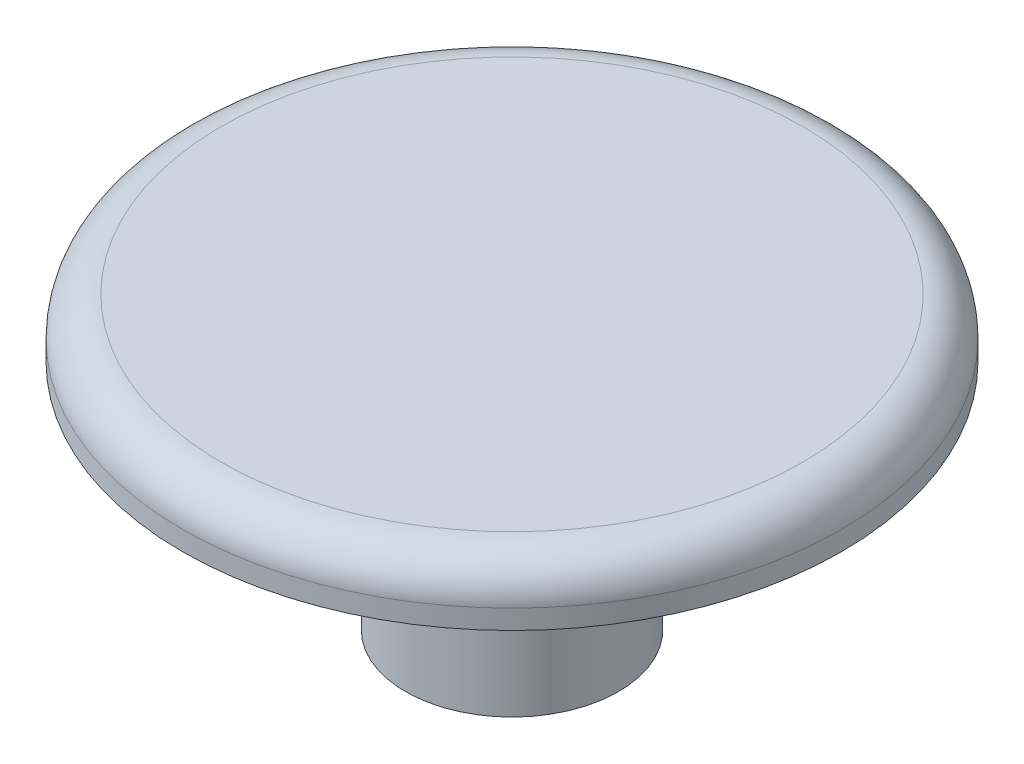
ISO-10303-21;
HEADER;
FILE_DESCRIPTION(('STEP AP214'),'2;1');
FILE_NAME('part.step','',(''),(''),'','','');
FILE_SCHEMA(('AUTOMOTIVE_DESIGN { 1 0 10303 214 1 1 1 1 }'));
ENDSEC;
DATA;
#1=APPLICATION_CONTEXT('core data for automotive mechanical design processes');
#2=APPLICATION_PROTOCOL_DEFINITION('international standard','automotive_design',2000,#1);
#3=PRODUCT_CONTEXT('',#1,'mechanical');
#4=PRODUCT('Part','Part','',(#3));
#5=PRODUCT_RELATED_PRODUCT_CATEGORY('part','',(#4));
#6=PRODUCT_DEFINITION_FORMATION('','',#4);
#7=PRODUCT_DEFINITION_CONTEXT('part definition',#1,'design');
#8=PRODUCT_DEFINITION('design','',#6,#7);
#9=PRODUCT_DEFINITION_SHAPE('','',#8);
#10=(LENGTH_UNIT() NAMED_UNIT(*) SI_UNIT(.MILLI.,.METRE.));
#11=(NAMED_UNIT(*) PLANE_ANGLE_UNIT() SI_UNIT($,.RADIAN.));
#12=(NAMED_UNIT(*) SI_UNIT($,.STERADIAN.) SOLID_ANGLE_UNIT());
#13=UNCERTAINTY_MEASURE_WITH_UNIT(LENGTH_MEASURE(1.E-05),#10,'distance_accuracy_value','');
#14=(GEOMETRIC_REPRESENTATION_CONTEXT(3) GLOBAL_UNCERTAINTY_ASSIGNED_CONTEXT((#13)) GLOBAL_UNIT_ASSIGNED_CONTEXT((#10,
#11,#12)) REPRESENTATION_CONTEXT('',''));
#15=CARTESIAN_POINT('',(0.,0.,0.));
#16=DIRECTION('',(0.,0.,1.));
#17=DIRECTION('',(1.,0.,0.));
#18=AXIS2_PLACEMENT_3D('',#15,#16,#17);
#19=CARTESIAN_POINT('',(0.,0.,0.));
#20=DIRECTION('',(0.,-1.,0.));
#21=DIRECTION('',(0.,0.,-1.));
#22=AXIS2_PLACEMENT_3D('',#19,#20,#21);
#23=PLANE('',#22);
#24=CARTESIAN_POINT('',(0.,0.,0.));
#25=DIRECTION('',(0.,-1.,0.));
#26=DIRECTION('',(0.,0.,-1.));
#27=AXIS2_PLACEMENT_3D('',#24,#25,#26);
#28=CIRCLE('',#27,5.5);
#29=CARTESIAN_POINT('',(0.,0.,-5.5));
#30=VERTEX_POINT('',#29);
#31=EDGE_CURVE('E10',#30,#30,#28,.T.);
#32=ORIENTED_EDGE('',*,*,#31,.T.);
#33=EDGE_LOOP('',(#32));
#34=FACE_BOUND('',#33,.T.);
#35=ADVANCED_FACE('F45',(#34),#23,.T.);
#36=CARTESIAN_POINT('',(0.,0.,0.));
#37=DIRECTION('',(0.,-1.,0.));
#38=DIRECTION('',(0.,0.,-1.));
#39=AXIS2_PLACEMENT_3D('',#36,#37,#38);
#40=CYLINDRICAL_SURFACE('',#39,5.5);
#41=CARTESIAN_POINT('',(0.,12.,0.));
#42=DIRECTION('',(0.,-1.,0.));
#43=DIRECTION('',(0.,0.,-1.));
#44=AXIS2_PLACEMENT_3D('',#41,#42,#43);
#45=CIRCLE('',#44,5.5);
#46=CARTESIAN_POINT('',(0.,12.,-5.5));
#47=VERTEX_POINT('',#46);
#48=EDGE_CURVE('E52',#47,#47,#45,.T.);
#49=ORIENTED_EDGE('',*,*,#48,.T.);
#50=EDGE_LOOP('',(#49));
#51=FACE_BOUND('',#50,.T.);
#52=ORIENTED_EDGE('',*,*,#31,.F.);
#53=EDGE_LOOP('',(#52));
#54=FACE_BOUND('',#53,.T.);
#55=ADVANCED_FACE('F85',(#51,#54),#40,.T.);
#56=CARTESIAN_POINT('',(5.5,12.,0.));
#57=DIRECTION('',(0.,-1.,0.));
#58=DIRECTION('',(0.,0.,-1.));
#59=AXIS2_PLACEMENT_3D('',#56,#57,#58);
#60=PLANE('',#59);
#61=CARTESIAN_POINT('',(0.,12.,0.));
#62=DIRECTION('',(0.,-1.,0.));
#63=DIRECTION('',(0.,0.,-1.));
#64=AXIS2_PLACEMENT_3D('',#61,#62,#63);
#65=CIRCLE('',#64,17.);
#66=CARTESIAN_POINT('',(0.,12.,-17.));
#67=VERTEX_POINT('',#66);
#68=EDGE_CURVE('E57',#67,#67,#65,.T.);
#69=ORIENTED_EDGE('',*,*,#68,.T.);
#70=EDGE_LOOP('',(#69));
#71=FACE_BOUND('',#70,.T.);
#72=ORIENTED_EDGE('',*,*,#48,.F.);
#73=EDGE_LOOP('',(#72));
#74=FACE_BOUND('',#73,.T.);
#75=ADVANCED_FACE('F89',(#71,#74),#60,.T.);
#76=CARTESIAN_POINT('',(0.,0.,0.));
#77=DIRECTION('',(0.,-1.,0.));
#78=DIRECTION('',(0.,0.,-1.));
#79=AXIS2_PLACEMENT_3D('',#76,#77,#78);
#80=CYLINDRICAL_SURFACE('',#79,17.);
#81=CARTESIAN_POINT('',(0.,13.,0.));
#82=DIRECTION('',(0.,-1.,0.));
#83=DIRECTION('',(0.,0.,-1.));
#84=AXIS2_PLACEMENT_3D('',#81,#82,#83);
#85=CIRCLE('',#84,17.);
#86=CARTESIAN_POINT('',(0.,13.,-17.));
#87=VERTEX_POINT('',#86);
#88=EDGE_CURVE('E62',#87,#87,#85,.T.);
#89=ORIENTED_EDGE('',*,*,#88,.T.);
#90=EDGE_LOOP('',(#89));
#91=FACE_BOUND('',#90,.T.);
#92=ORIENTED_EDGE('',*,*,#68,.F.);
#93=EDGE_LOOP('',(#92));
#94=FACE_BOUND('',#93,.T.);
#95=ADVANCED_FACE('F82',(#91,#94),#80,.T.);
#96=CARTESIAN_POINT('',(0.,13.,0.));
#97=DIRECTION('',(0.,-1.,0.));
#98=DIRECTION('',(0.,0.,-1.));
#99=AXIS2_PLACEMENT_3D('',#96,#97,#98);
#100=TOROIDAL_SURFACE('',#99,15.,2.);
#101=CARTESIAN_POINT('',(0.,15.,0.));
#102=DIRECTION('',(0.,-1.,0.));
#103=DIRECTION('',(0.,0.,-1.));
#104=AXIS2_PLACEMENT_3D('',#101,#102,#103);
#105=CIRCLE('',#104,15.);
#106=CARTESIAN_POINT('',(0.,15.,-15.));
#107=VERTEX_POINT('',#106);
#108=EDGE_CURVE('E68',#107,#107,#105,.T.);
#109=ORIENTED_EDGE('',*,*,#108,.T.);
#110=EDGE_LOOP('',(#109));
#111=FACE_BOUND('',#110,.T.);
#112=ORIENTED_EDGE('',*,*,#88,.F.);
#113=EDGE_LOOP('',(#112));
#114=FACE_BOUND('',#113,.T.);
#115=ADVANCED_FACE('F73',(#111,#114),#100,.T.);
#116=CARTESIAN_POINT('',(15.,15.,0.));
#117=DIRECTION('',(0.,1.,0.));
#118=DIRECTION('',(0.,0.,1.));
#119=AXIS2_PLACEMENT_3D('',#116,#117,#118);
#120=PLANE('',#119);
#121=ORIENTED_EDGE('',*,*,#108,.F.);
#122=EDGE_LOOP('',(#121));
#123=FACE_BOUND('',#122,.T.);
#124=ADVANCED_FACE('F76',(#123),#120,.T.);
#125=CLOSED_SHELL('',(#35,#55,#75,#95,#115,#124));
#126=MANIFOLD_SOLID_BREP('B2',#125);
#127=ADVANCED_BREP_SHAPE_REPRESENTATION('',(#18,#126),#14);
#128=SHAPE_DEFINITION_REPRESENTATION(#9,#127);
ENDSEC;
END-ISO-10303-21;
